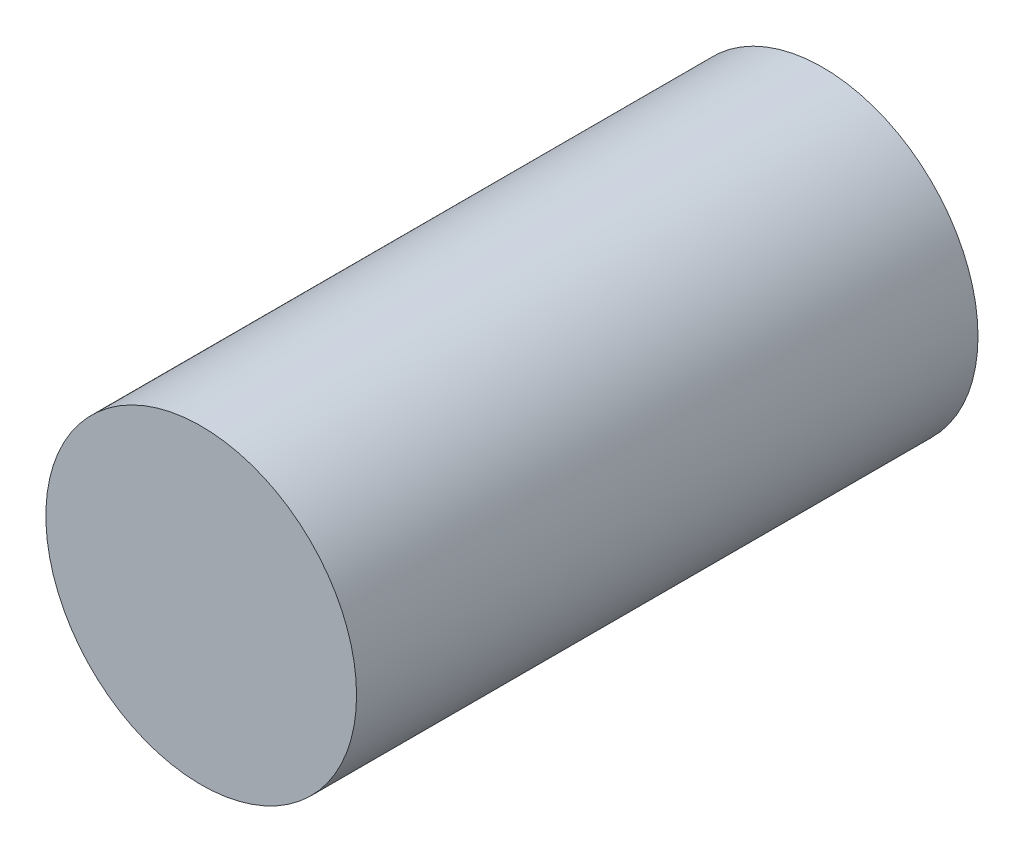
ISO-10303-21;
HEADER;
FILE_DESCRIPTION(('STEP AP214'),'2;1');
FILE_NAME('part.step','',(''),(''),'','','');
FILE_SCHEMA(('AUTOMOTIVE_DESIGN { 1 0 10303 214 1 1 1 1 }'));
ENDSEC;
DATA;
#1=APPLICATION_CONTEXT('core data for automotive mechanical design processes');
#2=APPLICATION_PROTOCOL_DEFINITION('international standard','automotive_design',2000,#1);
#3=PRODUCT_CONTEXT('',#1,'mechanical');
#4=PRODUCT('Part','Part','',(#3));
#5=PRODUCT_RELATED_PRODUCT_CATEGORY('part','',(#4));
#6=PRODUCT_DEFINITION_FORMATION('','',#4);
#7=PRODUCT_DEFINITION_CONTEXT('part definition',#1,'design');
#8=PRODUCT_DEFINITION('design','',#6,#7);
#9=PRODUCT_DEFINITION_SHAPE('','',#8);
#10=(LENGTH_UNIT() NAMED_UNIT(*) SI_UNIT(.MILLI.,.METRE.));
#11=(NAMED_UNIT(*) PLANE_ANGLE_UNIT() SI_UNIT($,.RADIAN.));
#12=(NAMED_UNIT(*) SI_UNIT($,.STERADIAN.) SOLID_ANGLE_UNIT());
#13=UNCERTAINTY_MEASURE_WITH_UNIT(LENGTH_MEASURE(1.E-05),#10,'distance_accuracy_value','');
#14=(GEOMETRIC_REPRESENTATION_CONTEXT(3) GLOBAL_UNCERTAINTY_ASSIGNED_CONTEXT((#13)) GLOBAL_UNIT_ASSIGNED_CONTEXT((#10,
#11,#12)) REPRESENTATION_CONTEXT('',''));
#15=CARTESIAN_POINT('',(0.,0.,0.));
#16=DIRECTION('',(0.,0.,1.));
#17=DIRECTION('',(1.,0.,0.));
#18=AXIS2_PLACEMENT_3D('',#15,#16,#17);
#19=CARTESIAN_POINT('',(0.,0.,4.));
#20=DIRECTION('',(0.,0.,-1.));
#21=DIRECTION('',(-1.,0.,0.));
#22=AXIS2_PLACEMENT_3D('',#19,#20,#21);
#23=CYLINDRICAL_SURFACE('',#22,1.);
#24=CARTESIAN_POINT('',(0.,0.,4.));
#25=DIRECTION('',(0.,0.,1.));
#26=DIRECTION('',(1.,0.,0.));
#27=AXIS2_PLACEMENT_3D('',#24,#25,#26);
#28=CIRCLE('',#27,1.);
#29=CARTESIAN_POINT('',(1.,0.,4.));
#30=VERTEX_POINT('',#29);
#31=EDGE_CURVE('E10',#30,#30,#28,.T.);
#32=ORIENTED_EDGE('',*,*,#31,.F.);
#33=EDGE_LOOP('',(#32));
#34=FACE_BOUND('',#33,.T.);
#35=CARTESIAN_POINT('',(0.,0.,0.));
#36=DIRECTION('',(0.,0.,1.));
#37=DIRECTION('',(1.,0.,0.));
#38=AXIS2_PLACEMENT_3D('',#35,#36,#37);
#39=CIRCLE('',#38,1.);
#40=CARTESIAN_POINT('',(1.,0.,0.));
#41=VERTEX_POINT('',#40);
#42=EDGE_CURVE('E44',#41,#41,#39,.T.);
#43=ORIENTED_EDGE('',*,*,#42,.T.);
#44=EDGE_LOOP('',(#43));
#45=FACE_BOUND('',#44,.T.);
#46=ADVANCED_FACE('F41',(#34,#45),#23,.T.);
#47=CARTESIAN_POINT('',(0.,0.,4.));
#48=DIRECTION('',(0.,0.,1.));
#49=DIRECTION('',(1.,0.,0.));
#50=AXIS2_PLACEMENT_3D('',#47,#48,#49);
#51=PLANE('',#50);
#52=ORIENTED_EDGE('',*,*,#31,.T.);
#53=EDGE_LOOP('',(#52));
#54=FACE_BOUND('',#53,.T.);
#55=ADVANCED_FACE('F58',(#54),#51,.T.);
#56=CARTESIAN_POINT('',(0.,0.,0.));
#57=DIRECTION('',(0.,0.,1.));
#58=DIRECTION('',(1.,0.,0.));
#59=AXIS2_PLACEMENT_3D('',#56,#57,#58);
#60=PLANE('',#59);
#61=ORIENTED_EDGE('',*,*,#42,.F.);
#62=EDGE_LOOP('',(#61));
#63=FACE_BOUND('',#62,.T.);
#64=ADVANCED_FACE('F56',(#63),#60,.F.);
#65=CLOSED_SHELL('',(#46,#55,#64));
#66=MANIFOLD_SOLID_BREP('B2',#65);
#67=ADVANCED_BREP_SHAPE_REPRESENTATION('',(#18,#66),#14);
#68=SHAPE_DEFINITION_REPRESENTATION(#9,#67);
ENDSEC;
END-ISO-10303-21;
